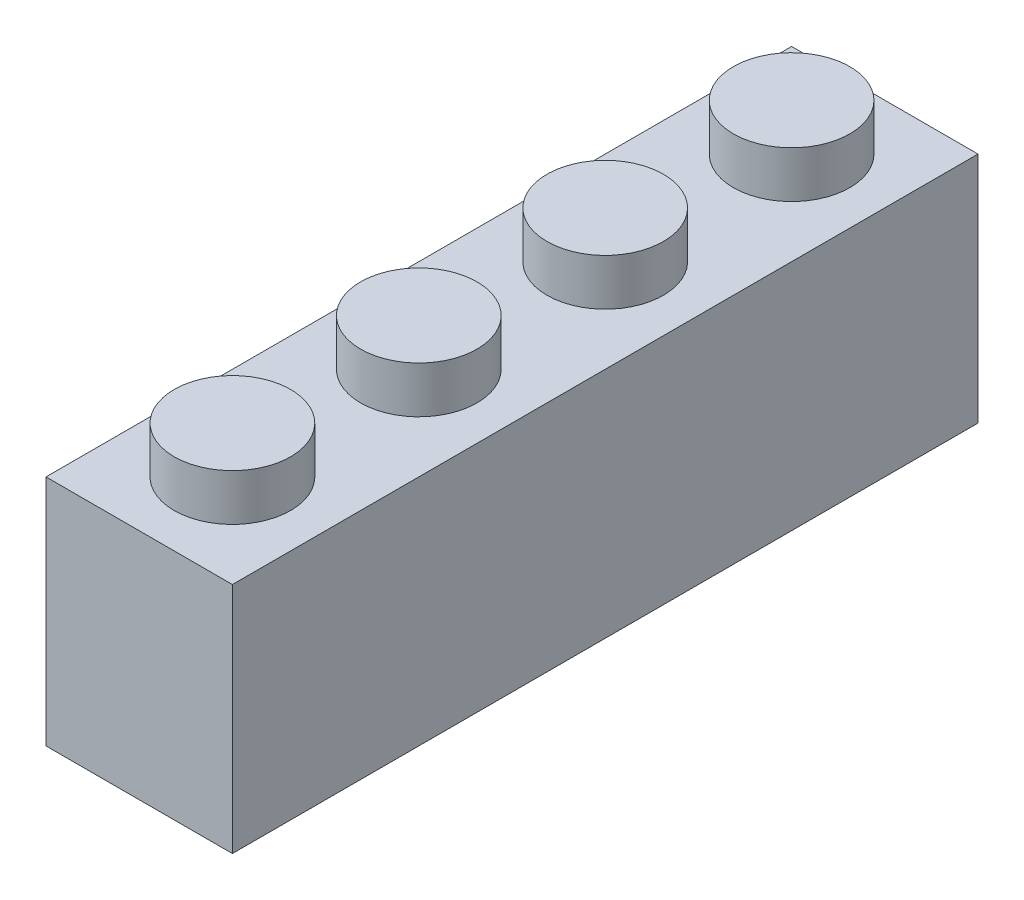
ISO-10303-21;
HEADER;
FILE_DESCRIPTION(('STEP AP214'),'2;1');
FILE_NAME('part.step','',(''),(''),'','','');
FILE_SCHEMA(('AUTOMOTIVE_DESIGN { 1 0 10303 214 1 1 1 1 }'));
ENDSEC;
DATA;
#1=APPLICATION_CONTEXT('core data for automotive mechanical design processes');
#2=APPLICATION_PROTOCOL_DEFINITION('international standard','automotive_design',2000,#1);
#3=PRODUCT_CONTEXT('',#1,'mechanical');
#4=PRODUCT('Part','Part','',(#3));
#5=PRODUCT_RELATED_PRODUCT_CATEGORY('part','',(#4));
#6=PRODUCT_DEFINITION_FORMATION('','',#4);
#7=PRODUCT_DEFINITION_CONTEXT('part definition',#1,'design');
#8=PRODUCT_DEFINITION('design','',#6,#7);
#9=PRODUCT_DEFINITION_SHAPE('','',#8);
#10=(LENGTH_UNIT() NAMED_UNIT(*) SI_UNIT(.MILLI.,.METRE.));
#11=(NAMED_UNIT(*) PLANE_ANGLE_UNIT() SI_UNIT($,.RADIAN.));
#12=(NAMED_UNIT(*) SI_UNIT($,.STERADIAN.) SOLID_ANGLE_UNIT());
#13=UNCERTAINTY_MEASURE_WITH_UNIT(LENGTH_MEASURE(1.E-05),#10,'distance_accuracy_value','');
#14=(GEOMETRIC_REPRESENTATION_CONTEXT(3) GLOBAL_UNCERTAINTY_ASSIGNED_CONTEXT((#13)) GLOBAL_UNIT_ASSIGNED_CONTEXT((#10,
#11,#12)) REPRESENTATION_CONTEXT('',''));
#15=CARTESIAN_POINT('',(0.,0.,0.));
#16=DIRECTION('',(0.,0.,1.));
#17=DIRECTION('',(1.,0.,0.));
#18=AXIS2_PLACEMENT_3D('',#15,#16,#17);
#19=CARTESIAN_POINT('',(-4.,4.,16.));
#20=DIRECTION('',(0.,1.,0.));
#21=DIRECTION('',(0.,0.,1.));
#22=AXIS2_PLACEMENT_3D('',#19,#20,#21);
#23=PLANE('',#22);
#24=CARTESIAN_POINT('',(0.,4.,12.));
#25=DIRECTION('',(0.,1.,0.));
#26=DIRECTION('',(0.,0.,1.));
#27=AXIS2_PLACEMENT_3D('',#24,#25,#26);
#28=CIRCLE('',#27,1.5);
#29=CARTESIAN_POINT('',(0.,4.,13.5));
#30=VERTEX_POINT('',#29);
#31=EDGE_CURVE('E179',#30,#30,#28,.T.);
#32=ORIENTED_EDGE('',*,*,#31,.T.);
#33=EDGE_LOOP('',(#32));
#34=FACE_BOUND('',#33,.T.);
#35=DIRECTION('',(0.,0.,1.));
#36=VECTOR('',#35,1.);
#37=CARTESIAN_POINT('',(-3.00000000000001,4.,-16.));
#38=LINE('',#37,#36);
#39=CARTESIAN_POINT('',(-3.00000000000001,4.,-15.));
#40=VERTEX_POINT('',#39);
#41=CARTESIAN_POINT('',(-3.,4.,15.));
#42=VERTEX_POINT('',#41);
#43=EDGE_CURVE('E135',#40,#42,#38,.T.);
#44=ORIENTED_EDGE('',*,*,#43,.F.);
#45=DIRECTION('',(-1.,0.,0.));
#46=VECTOR('',#45,1.);
#47=CARTESIAN_POINT('',(-4.00000000000001,4.,-15.));
#48=LINE('',#47,#46);
#49=CARTESIAN_POINT('',(2.99999999999999,4.,-15.));
#50=VERTEX_POINT('',#49);
#51=EDGE_CURVE('E144',#50,#40,#48,.T.);
#52=ORIENTED_EDGE('',*,*,#51,.F.);
#53=DIRECTION('',(0.,0.,-1.));
#54=VECTOR('',#53,1.);
#55=CARTESIAN_POINT('',(2.99999999999999,4.,-16.));
#56=LINE('',#55,#54);
#57=CARTESIAN_POINT('',(3.,4.,15.));
#58=VERTEX_POINT('',#57);
#59=EDGE_CURVE('E134',#58,#50,#56,.T.);
#60=ORIENTED_EDGE('',*,*,#59,.F.);
#61=DIRECTION('',(1.,0.,0.));
#62=VECTOR('',#61,1.);
#63=CARTESIAN_POINT('',(-4.,4.,15.));
#64=LINE('',#63,#62);
#65=EDGE_CURVE('E123',#42,#58,#64,.T.);
#66=ORIENTED_EDGE('',*,*,#65,.F.);
#67=EDGE_LOOP('',(#44,#52,#60,#66));
#68=FACE_BOUND('',#67,.T.);
#69=CARTESIAN_POINT('',(0.,4.,4.));
#70=DIRECTION('',(0.,1.,0.));
#71=DIRECTION('',(0.,0.,1.));
#72=AXIS2_PLACEMENT_3D('',#69,#70,#71);
#73=CIRCLE('',#72,1.5);
#74=CARTESIAN_POINT('',(0.,4.,5.5));
#75=VERTEX_POINT('',#74);
#76=EDGE_CURVE('E152',#75,#75,#73,.T.);
#77=ORIENTED_EDGE('',*,*,#76,.T.);
#78=EDGE_LOOP('',(#77));
#79=FACE_BOUND('',#78,.T.);
#80=CARTESIAN_POINT('',(0.,4.,-4.));
#81=DIRECTION('',(0.,1.,0.));
#82=DIRECTION('',(0.,0.,1.));
#83=AXIS2_PLACEMENT_3D('',#80,#81,#82);
#84=CIRCLE('',#83,1.5);
#85=CARTESIAN_POINT('',(0.,4.,-2.5));
#86=VERTEX_POINT('',#85);
#87=EDGE_CURVE('E158',#86,#86,#84,.T.);
#88=ORIENTED_EDGE('',*,*,#87,.T.);
#89=EDGE_LOOP('',(#88));
#90=FACE_BOUND('',#89,.T.);
#91=CARTESIAN_POINT('',(0.,4.,-12.));
#92=DIRECTION('',(0.,1.,0.));
#93=DIRECTION('',(0.,0.,1.));
#94=AXIS2_PLACEMENT_3D('',#91,#92,#93);
#95=CIRCLE('',#94,1.5);
#96=CARTESIAN_POINT('',(0.,4.,-10.5));
#97=VERTEX_POINT('',#96);
#98=EDGE_CURVE('E163',#97,#97,#95,.T.);
#99=ORIENTED_EDGE('',*,*,#98,.T.);
#100=EDGE_LOOP('',(#99));
#101=FACE_BOUND('',#100,.T.);
#102=CARTESIAN_POINT('',(0.,4.,8.));
#103=DIRECTION('',(0.,1.,0.));
#104=DIRECTION('',(0.,0.,1.));
#105=AXIS2_PLACEMENT_3D('',#102,#103,#104);
#106=CIRCLE('',#105,1.);
#107=CARTESIAN_POINT('',(0.,4.,9.));
#108=VERTEX_POINT('',#107);
#109=EDGE_CURVE('E268',#108,#108,#106,.F.);
#110=ORIENTED_EDGE('',*,*,#109,.F.);
#111=EDGE_LOOP('',(#110));
#112=FACE_BOUND('',#111,.T.);
#113=CARTESIAN_POINT('',(0.,4.,0.));
#114=DIRECTION('',(0.,1.,0.));
#115=DIRECTION('',(0.,0.,1.));
#116=AXIS2_PLACEMENT_3D('',#113,#114,#115);
#117=CIRCLE('',#116,1.);
#118=CARTESIAN_POINT('',(0.,4.,1.));
#119=VERTEX_POINT('',#118);
#120=EDGE_CURVE('E56',#119,#119,#117,.F.);
#121=ORIENTED_EDGE('',*,*,#120,.F.);
#122=EDGE_LOOP('',(#121));
#123=FACE_BOUND('',#122,.T.);
#124=CARTESIAN_POINT('',(0.,4.,-8.));
#125=DIRECTION('',(0.,1.,0.));
#126=DIRECTION('',(0.,0.,1.));
#127=AXIS2_PLACEMENT_3D('',#124,#125,#126);
#128=CIRCLE('',#127,1.);
#129=CARTESIAN_POINT('',(0.,4.,-7.));
#130=VERTEX_POINT('',#129);
#131=EDGE_CURVE('E12',#130,#130,#128,.F.);
#132=ORIENTED_EDGE('',*,*,#131,.F.);
#133=EDGE_LOOP('',(#132));
#134=FACE_BOUND('',#133,.T.);
#135=ADVANCED_FACE('F47',(#34,#68,#79,#90,#101,#112,#123,#134),#23,.F.);
#136=CARTESIAN_POINT('',(-4.,5.,16.));
#137=DIRECTION('',(0.,1.,0.));
#138=DIRECTION('',(0.,0.,1.));
#139=AXIS2_PLACEMENT_3D('',#136,#137,#138);
#140=PLANE('',#139);
#141=CARTESIAN_POINT('',(0.,5.,12.));
#142=DIRECTION('',(0.,1.,0.));
#143=DIRECTION('',(0.,0.,1.));
#144=AXIS2_PLACEMENT_3D('',#141,#142,#143);
#145=CIRCLE('',#144,2.5);
#146=CARTESIAN_POINT('',(0.,5.,14.5));
#147=VERTEX_POINT('',#146);
#148=EDGE_CURVE('E209',#147,#147,#145,.T.);
#149=ORIENTED_EDGE('',*,*,#148,.F.);
#150=EDGE_LOOP('',(#149));
#151=FACE_BOUND('',#150,.T.);
#152=DIRECTION('',(0.,0.,1.));
#153=VECTOR('',#152,1.);
#154=CARTESIAN_POINT('',(-4.00000000000001,5.,-16.));
#155=LINE('',#154,#153);
#156=CARTESIAN_POINT('',(-4.00000000000001,5.,-16.));
#157=VERTEX_POINT('',#156);
#158=CARTESIAN_POINT('',(-4.,5.,16.));
#159=VERTEX_POINT('',#158);
#160=EDGE_CURVE('E218',#157,#159,#155,.T.);
#161=ORIENTED_EDGE('',*,*,#160,.T.);
#162=DIRECTION('',(1.,0.,0.));
#163=VECTOR('',#162,1.);
#164=CARTESIAN_POINT('',(-4.,5.,16.));
#165=LINE('',#164,#163);
#166=CARTESIAN_POINT('',(4.,5.,16.));
#167=VERTEX_POINT('',#166);
#168=EDGE_CURVE('E101',#159,#167,#165,.T.);
#169=ORIENTED_EDGE('',*,*,#168,.T.);
#170=DIRECTION('',(0.,0.,-1.));
#171=VECTOR('',#170,1.);
#172=CARTESIAN_POINT('',(3.99999999999999,5.,-16.));
#173=LINE('',#172,#171);
#174=CARTESIAN_POINT('',(3.99999999999999,5.,-16.));
#175=VERTEX_POINT('',#174);
#176=EDGE_CURVE('E223',#167,#175,#173,.T.);
#177=ORIENTED_EDGE('',*,*,#176,.T.);
#178=DIRECTION('',(-1.,0.,0.));
#179=VECTOR('',#178,1.);
#180=CARTESIAN_POINT('',(-4.00000000000001,5.,-16.));
#181=LINE('',#180,#179);
#182=EDGE_CURVE('E72',#175,#157,#181,.T.);
#183=ORIENTED_EDGE('',*,*,#182,.T.);
#184=EDGE_LOOP('',(#161,#169,#177,#183));
#185=FACE_BOUND('',#184,.T.);
#186=CARTESIAN_POINT('',(0.,5.,4.));
#187=DIRECTION('',(0.,1.,0.));
#188=DIRECTION('',(0.,0.,1.));
#189=AXIS2_PLACEMENT_3D('',#186,#187,#188);
#190=CIRCLE('',#189,2.5);
#191=CARTESIAN_POINT('',(0.,5.,6.5));
#192=VERTEX_POINT('',#191);
#193=EDGE_CURVE('E189',#192,#192,#190,.T.);
#194=ORIENTED_EDGE('',*,*,#193,.F.);
#195=EDGE_LOOP('',(#194));
#196=FACE_BOUND('',#195,.T.);
#197=CARTESIAN_POINT('',(0.,5.,-4.));
#198=DIRECTION('',(0.,1.,0.));
#199=DIRECTION('',(0.,0.,1.));
#200=AXIS2_PLACEMENT_3D('',#197,#198,#199);
#201=CIRCLE('',#200,2.5);
#202=CARTESIAN_POINT('',(0.,5.,-1.5));
#203=VERTEX_POINT('',#202);
#204=EDGE_CURVE('E252',#203,#203,#201,.T.);
#205=ORIENTED_EDGE('',*,*,#204,.F.);
#206=EDGE_LOOP('',(#205));
#207=FACE_BOUND('',#206,.T.);
#208=CARTESIAN_POINT('',(0.,5.,-12.));
#209=DIRECTION('',(0.,1.,0.));
#210=DIRECTION('',(0.,0.,1.));
#211=AXIS2_PLACEMENT_3D('',#208,#209,#210);
#212=CIRCLE('',#211,2.5);
#213=CARTESIAN_POINT('',(0.,5.,-9.5));
#214=VERTEX_POINT('',#213);
#215=EDGE_CURVE('E260',#214,#214,#212,.T.);
#216=ORIENTED_EDGE('',*,*,#215,.F.);
#217=EDGE_LOOP('',(#216));
#218=FACE_BOUND('',#217,.T.);
#219=ADVANCED_FACE('F279',(#151,#185,#196,#207,#218),#140,.T.);
#220=CARTESIAN_POINT('',(-4.00000000000001,5.,-16.));
#221=DIRECTION('',(1.,0.,0.));
#222=DIRECTION('',(0.,0.,-1.));
#223=AXIS2_PLACEMENT_3D('',#220,#221,#222);
#224=PLANE('',#223);
#225=DIRECTION('',(0.,0.,1.));
#226=VECTOR('',#225,1.);
#227=CARTESIAN_POINT('',(-4.00000000000001,-5.,-16.));
#228=LINE('',#227,#226);
#229=CARTESIAN_POINT('',(-4.00000000000001,-5.,-16.));
#230=VERTEX_POINT('',#229);
#231=CARTESIAN_POINT('',(-4.,-5.,16.));
#232=VERTEX_POINT('',#231);
#233=EDGE_CURVE('E214',#230,#232,#228,.T.);
#234=ORIENTED_EDGE('',*,*,#233,.T.);
#235=DIRECTION('',(0.,-1.,0.));
#236=VECTOR('',#235,1.);
#237=CARTESIAN_POINT('',(-4.,5.,16.));
#238=LINE('',#237,#236);
#239=EDGE_CURVE('E249',#159,#232,#238,.T.);
#240=ORIENTED_EDGE('',*,*,#239,.F.);
#241=ORIENTED_EDGE('',*,*,#160,.F.);
#242=DIRECTION('',(0.,-1.,0.));
#243=VECTOR('',#242,1.);
#244=CARTESIAN_POINT('',(-4.00000000000001,5.,-16.));
#245=LINE('',#244,#243);
#246=EDGE_CURVE('E228',#157,#230,#245,.T.);
#247=ORIENTED_EDGE('',*,*,#246,.T.);
#248=EDGE_LOOP('',(#234,#240,#241,#247));
#249=FACE_BOUND('',#248,.T.);
#250=ADVANCED_FACE('F376',(#249),#224,.F.);
#251=CARTESIAN_POINT('',(-4.,5.,16.));
#252=DIRECTION('',(0.,0.,-1.));
#253=DIRECTION('',(-1.,0.,0.));
#254=AXIS2_PLACEMENT_3D('',#251,#252,#253);
#255=PLANE('',#254);
#256=DIRECTION('',(1.,0.,0.));
#257=VECTOR('',#256,1.);
#258=CARTESIAN_POINT('',(-4.,-5.,16.));
#259=LINE('',#258,#257);
#260=CARTESIAN_POINT('',(4.,-5.,16.));
#261=VERTEX_POINT('',#260);
#262=EDGE_CURVE('E232',#232,#261,#259,.T.);
#263=ORIENTED_EDGE('',*,*,#262,.T.);
#264=DIRECTION('',(0.,-1.,0.));
#265=VECTOR('',#264,1.);
#266=CARTESIAN_POINT('',(4.,5.,16.));
#267=LINE('',#266,#265);
#268=EDGE_CURVE('E245',#167,#261,#267,.T.);
#269=ORIENTED_EDGE('',*,*,#268,.F.);
#270=ORIENTED_EDGE('',*,*,#168,.F.);
#271=ORIENTED_EDGE('',*,*,#239,.T.);
#272=EDGE_LOOP('',(#263,#269,#270,#271));
#273=FACE_BOUND('',#272,.T.);
#274=ADVANCED_FACE('F387',(#273),#255,.F.);
#275=CARTESIAN_POINT('',(3.99999999999999,5.,-16.));
#276=DIRECTION('',(-1.,0.,0.));
#277=DIRECTION('',(0.,0.,1.));
#278=AXIS2_PLACEMENT_3D('',#275,#276,#277);
#279=PLANE('',#278);
#280=DIRECTION('',(0.,0.,-1.));
#281=VECTOR('',#280,1.);
#282=CARTESIAN_POINT('',(3.99999999999999,-5.,-16.));
#283=LINE('',#282,#281);
#284=CARTESIAN_POINT('',(3.99999999999999,-5.,-16.));
#285=VERTEX_POINT('',#284);
#286=EDGE_CURVE('E235',#261,#285,#283,.T.);
#287=ORIENTED_EDGE('',*,*,#286,.T.);
#288=DIRECTION('',(0.,-1.,0.));
#289=VECTOR('',#288,1.);
#290=CARTESIAN_POINT('',(3.99999999999999,5.,-16.));
#291=LINE('',#290,#289);
#292=EDGE_CURVE('E242',#175,#285,#291,.T.);
#293=ORIENTED_EDGE('',*,*,#292,.F.);
#294=ORIENTED_EDGE('',*,*,#176,.F.);
#295=ORIENTED_EDGE('',*,*,#268,.T.);
#296=EDGE_LOOP('',(#287,#293,#294,#295));
#297=FACE_BOUND('',#296,.T.);
#298=ADVANCED_FACE('F384',(#297),#279,.F.);
#299=CARTESIAN_POINT('',(-4.00000000000001,5.,-16.));
#300=DIRECTION('',(0.,0.,1.));
#301=DIRECTION('',(1.,0.,0.));
#302=AXIS2_PLACEMENT_3D('',#299,#300,#301);
#303=PLANE('',#302);
#304=DIRECTION('',(-1.,0.,0.));
#305=VECTOR('',#304,1.);
#306=CARTESIAN_POINT('',(-4.00000000000001,-5.,-16.));
#307=LINE('',#306,#305);
#308=EDGE_CURVE('E93',#285,#230,#307,.T.);
#309=ORIENTED_EDGE('',*,*,#308,.T.);
#310=ORIENTED_EDGE('',*,*,#246,.F.);
#311=ORIENTED_EDGE('',*,*,#182,.F.);
#312=ORIENTED_EDGE('',*,*,#292,.T.);
#313=EDGE_LOOP('',(#309,#310,#311,#312));
#314=FACE_BOUND('',#313,.T.);
#315=ADVANCED_FACE('F380',(#314),#303,.F.);
#316=CARTESIAN_POINT('',(-4.,-5.,16.));
#317=DIRECTION('',(0.,1.,0.));
#318=DIRECTION('',(0.,0.,1.));
#319=AXIS2_PLACEMENT_3D('',#316,#317,#318);
#320=PLANE('',#319);
#321=DIRECTION('',(-1.,0.,0.));
#322=VECTOR('',#321,1.);
#323=CARTESIAN_POINT('',(-4.00000000000001,-5.,-15.));
#324=LINE('',#323,#322);
#325=CARTESIAN_POINT('',(2.99999999999999,-5.,-15.));
#326=VERTEX_POINT('',#325);
#327=CARTESIAN_POINT('',(-3.00000000000001,-5.,-15.));
#328=VERTEX_POINT('',#327);
#329=EDGE_CURVE('E194',#326,#328,#324,.T.);
#330=ORIENTED_EDGE('',*,*,#329,.T.);
#331=DIRECTION('',(0.,0.,1.));
#332=VECTOR('',#331,1.);
#333=CARTESIAN_POINT('',(-3.00000000000001,-5.,-16.));
#334=LINE('',#333,#332);
#335=CARTESIAN_POINT('',(-3.,-5.,15.));
#336=VERTEX_POINT('',#335);
#337=EDGE_CURVE('E178',#328,#336,#334,.T.);
#338=ORIENTED_EDGE('',*,*,#337,.T.);
#339=DIRECTION('',(1.,0.,0.));
#340=VECTOR('',#339,1.);
#341=CARTESIAN_POINT('',(-4.,-5.,15.));
#342=LINE('',#341,#340);
#343=CARTESIAN_POINT('',(3.,-5.,15.));
#344=VERTEX_POINT('',#343);
#345=EDGE_CURVE('E193',#336,#344,#342,.T.);
#346=ORIENTED_EDGE('',*,*,#345,.T.);
#347=DIRECTION('',(0.,0.,-1.));
#348=VECTOR('',#347,1.);
#349=CARTESIAN_POINT('',(2.99999999999999,-5.,-16.));
#350=LINE('',#349,#348);
#351=EDGE_CURVE('E63',#344,#326,#350,.T.);
#352=ORIENTED_EDGE('',*,*,#351,.T.);
#353=EDGE_LOOP('',(#330,#338,#346,#352));
#354=FACE_BOUND('',#353,.T.);
#355=ORIENTED_EDGE('',*,*,#233,.F.);
#356=ORIENTED_EDGE('',*,*,#308,.F.);
#357=ORIENTED_EDGE('',*,*,#286,.F.);
#358=ORIENTED_EDGE('',*,*,#262,.F.);
#359=EDGE_LOOP('',(#355,#356,#357,#358));
#360=FACE_BOUND('',#359,.T.);
#361=ADVANCED_FACE('F372',(#354,#360),#320,.F.);
#362=CARTESIAN_POINT('',(0.,7.,12.));
#363=DIRECTION('',(0.,-1.,0.));
#364=DIRECTION('',(0.,0.,-1.));
#365=AXIS2_PLACEMENT_3D('',#362,#363,#364);
#366=CYLINDRICAL_SURFACE('',#365,2.5);
#367=CARTESIAN_POINT('',(0.,7.,12.));
#368=DIRECTION('',(0.,1.,0.));
#369=DIRECTION('',(0.,0.,1.));
#370=AXIS2_PLACEMENT_3D('',#367,#368,#369);
#371=CIRCLE('',#370,2.5);
#372=CARTESIAN_POINT('',(0.,7.,14.5));
#373=VERTEX_POINT('',#372);
#374=EDGE_CURVE('E210',#373,#373,#371,.T.);
#375=ORIENTED_EDGE('',*,*,#374,.F.);
#376=EDGE_LOOP('',(#375));
#377=FACE_BOUND('',#376,.T.);
#378=ORIENTED_EDGE('',*,*,#148,.T.);
#379=EDGE_LOOP('',(#378));
#380=FACE_BOUND('',#379,.T.);
#381=ADVANCED_FACE('F368',(#377,#380),#366,.T.);
#382=CARTESIAN_POINT('',(0.,7.,12.));
#383=DIRECTION('',(0.,1.,0.));
#384=DIRECTION('',(0.,0.,1.));
#385=AXIS2_PLACEMENT_3D('',#382,#383,#384);
#386=PLANE('',#385);
#387=ORIENTED_EDGE('',*,*,#374,.T.);
#388=EDGE_LOOP('',(#387));
#389=FACE_BOUND('',#388,.T.);
#390=ADVANCED_FACE('F364',(#389),#386,.T.);
#391=CARTESIAN_POINT('',(0.,7.,4.));
#392=DIRECTION('',(0.,-1.,0.));
#393=DIRECTION('',(0.,0.,-1.));
#394=AXIS2_PLACEMENT_3D('',#391,#392,#393);
#395=CYLINDRICAL_SURFACE('',#394,2.5);
#396=CARTESIAN_POINT('',(0.,7.,4.));
#397=DIRECTION('',(0.,1.,0.));
#398=DIRECTION('',(0.,0.,1.));
#399=AXIS2_PLACEMENT_3D('',#396,#397,#398);
#400=CIRCLE('',#399,2.5);
#401=CARTESIAN_POINT('',(0.,7.,6.5));
#402=VERTEX_POINT('',#401);
#403=EDGE_CURVE('E205',#402,#402,#400,.T.);
#404=ORIENTED_EDGE('',*,*,#403,.F.);
#405=EDGE_LOOP('',(#404));
#406=FACE_BOUND('',#405,.T.);
#407=ORIENTED_EDGE('',*,*,#193,.T.);
#408=EDGE_LOOP('',(#407));
#409=FACE_BOUND('',#408,.T.);
#410=ADVANCED_FACE('F360',(#406,#409),#395,.T.);
#411=CARTESIAN_POINT('',(0.,7.,4.));
#412=DIRECTION('',(0.,1.,0.));
#413=DIRECTION('',(0.,0.,1.));
#414=AXIS2_PLACEMENT_3D('',#411,#412,#413);
#415=PLANE('',#414);
#416=ORIENTED_EDGE('',*,*,#403,.T.);
#417=EDGE_LOOP('',(#416));
#418=FACE_BOUND('',#417,.T.);
#419=ADVANCED_FACE('F356',(#418),#415,.T.);
#420=CARTESIAN_POINT('',(0.,7.,-4.));
#421=DIRECTION('',(0.,1.,0.));
#422=DIRECTION('',(0.,0.,1.));
#423=AXIS2_PLACEMENT_3D('',#420,#421,#422);
#424=PLANE('',#423);
#425=CARTESIAN_POINT('',(0.,7.,-4.));
#426=DIRECTION('',(0.,1.,0.));
#427=DIRECTION('',(0.,0.,1.));
#428=AXIS2_PLACEMENT_3D('',#425,#426,#427);
#429=CIRCLE('',#428,2.5);
#430=CARTESIAN_POINT('',(0.,7.,-1.5));
#431=VERTEX_POINT('',#430);
#432=EDGE_CURVE('E256',#431,#431,#429,.T.);
#433=ORIENTED_EDGE('',*,*,#432,.T.);
#434=EDGE_LOOP('',(#433));
#435=FACE_BOUND('',#434,.T.);
#436=ADVANCED_FACE('F359',(#435),#424,.T.);
#437=CARTESIAN_POINT('',(0.,7.,-4.));
#438=DIRECTION('',(0.,-1.,0.));
#439=DIRECTION('',(0.,0.,-1.));
#440=AXIS2_PLACEMENT_3D('',#437,#438,#439);
#441=CYLINDRICAL_SURFACE('',#440,2.5);
#442=ORIENTED_EDGE('',*,*,#432,.F.);
#443=EDGE_LOOP('',(#442));
#444=FACE_BOUND('',#443,.T.);
#445=ORIENTED_EDGE('',*,*,#204,.T.);
#446=EDGE_LOOP('',(#445));
#447=FACE_BOUND('',#446,.T.);
#448=ADVANCED_FACE('F394',(#444,#447),#441,.T.);
#449=CARTESIAN_POINT('',(0.,7.,-12.));
#450=DIRECTION('',(0.,1.,0.));
#451=DIRECTION('',(0.,0.,1.));
#452=AXIS2_PLACEMENT_3D('',#449,#450,#451);
#453=PLANE('',#452);
#454=CARTESIAN_POINT('',(0.,7.,-12.));
#455=DIRECTION('',(0.,1.,0.));
#456=DIRECTION('',(0.,0.,1.));
#457=AXIS2_PLACEMENT_3D('',#454,#455,#456);
#458=CIRCLE('',#457,2.5);
#459=CARTESIAN_POINT('',(0.,7.,-9.5));
#460=VERTEX_POINT('',#459);
#461=EDGE_CURVE('E264',#460,#460,#458,.T.);
#462=ORIENTED_EDGE('',*,*,#461,.T.);
#463=EDGE_LOOP('',(#462));
#464=FACE_BOUND('',#463,.T.);
#465=ADVANCED_FACE('F49',(#464),#453,.T.);
#466=CARTESIAN_POINT('',(0.,7.,-12.));
#467=DIRECTION('',(0.,-1.,0.));
#468=DIRECTION('',(0.,0.,-1.));
#469=AXIS2_PLACEMENT_3D('',#466,#467,#468);
#470=CYLINDRICAL_SURFACE('',#469,2.5);
#471=ORIENTED_EDGE('',*,*,#461,.F.);
#472=EDGE_LOOP('',(#471));
#473=FACE_BOUND('',#472,.T.);
#474=ORIENTED_EDGE('',*,*,#215,.T.);
#475=EDGE_LOOP('',(#474));
#476=FACE_BOUND('',#475,.T.);
#477=ADVANCED_FACE('F315',(#473,#476),#470,.T.);
#478=CARTESIAN_POINT('',(-3.00000000000001,5.,-16.));
#479=DIRECTION('',(1.,0.,0.));
#480=DIRECTION('',(0.,0.,-1.));
#481=AXIS2_PLACEMENT_3D('',#478,#479,#480);
#482=PLANE('',#481);
#483=ORIENTED_EDGE('',*,*,#337,.F.);
#484=DIRECTION('',(0.,-1.,0.));
#485=VECTOR('',#484,1.);
#486=CARTESIAN_POINT('',(-3.00000000000001,5.,-15.));
#487=LINE('',#486,#485);
#488=EDGE_CURVE('E148',#40,#328,#487,.T.);
#489=ORIENTED_EDGE('',*,*,#488,.F.);
#490=ORIENTED_EDGE('',*,*,#43,.T.);
#491=DIRECTION('',(0.,-1.,0.));
#492=VECTOR('',#491,1.);
#493=CARTESIAN_POINT('',(-3.,5.,15.));
#494=LINE('',#493,#492);
#495=EDGE_CURVE('E128',#42,#336,#494,.T.);
#496=ORIENTED_EDGE('',*,*,#495,.T.);
#497=EDGE_LOOP('',(#483,#489,#490,#496));
#498=FACE_BOUND('',#497,.T.);
#499=ADVANCED_FACE('F312',(#498),#482,.T.);
#500=CARTESIAN_POINT('',(-4.,5.,15.));
#501=DIRECTION('',(0.,0.,-1.));
#502=DIRECTION('',(-1.,0.,0.));
#503=AXIS2_PLACEMENT_3D('',#500,#501,#502);
#504=PLANE('',#503);
#505=ORIENTED_EDGE('',*,*,#345,.F.);
#506=ORIENTED_EDGE('',*,*,#495,.F.);
#507=ORIENTED_EDGE('',*,*,#65,.T.);
#508=DIRECTION('',(0.,-1.,0.));
#509=VECTOR('',#508,1.);
#510=CARTESIAN_POINT('',(3.,5.,15.));
#511=LINE('',#510,#509);
#512=EDGE_CURVE('E125',#58,#344,#511,.T.);
#513=ORIENTED_EDGE('',*,*,#512,.T.);
#514=EDGE_LOOP('',(#505,#506,#507,#513));
#515=FACE_BOUND('',#514,.T.);
#516=ADVANCED_FACE('F124',(#515),#504,.T.);
#517=CARTESIAN_POINT('',(2.99999999999999,5.,-16.));
#518=DIRECTION('',(-1.,0.,0.));
#519=DIRECTION('',(0.,0.,1.));
#520=AXIS2_PLACEMENT_3D('',#517,#518,#519);
#521=PLANE('',#520);
#522=ORIENTED_EDGE('',*,*,#351,.F.);
#523=ORIENTED_EDGE('',*,*,#512,.F.);
#524=ORIENTED_EDGE('',*,*,#59,.T.);
#525=DIRECTION('',(0.,-1.,0.));
#526=VECTOR('',#525,1.);
#527=CARTESIAN_POINT('',(2.99999999999999,5.,-15.));
#528=LINE('',#527,#526);
#529=EDGE_CURVE('E140',#50,#326,#528,.T.);
#530=ORIENTED_EDGE('',*,*,#529,.T.);
#531=EDGE_LOOP('',(#522,#523,#524,#530));
#532=FACE_BOUND('',#531,.T.);
#533=ADVANCED_FACE('F137',(#532),#521,.T.);
#534=CARTESIAN_POINT('',(-4.00000000000001,5.,-15.));
#535=DIRECTION('',(0.,0.,1.));
#536=DIRECTION('',(1.,0.,0.));
#537=AXIS2_PLACEMENT_3D('',#534,#535,#536);
#538=PLANE('',#537);
#539=ORIENTED_EDGE('',*,*,#329,.F.);
#540=ORIENTED_EDGE('',*,*,#529,.F.);
#541=ORIENTED_EDGE('',*,*,#51,.T.);
#542=ORIENTED_EDGE('',*,*,#488,.T.);
#543=EDGE_LOOP('',(#539,#540,#541,#542));
#544=FACE_BOUND('',#543,.T.);
#545=ADVANCED_FACE('F321',(#544),#538,.T.);
#546=CARTESIAN_POINT('',(0.,7.,12.));
#547=DIRECTION('',(0.,-1.,0.));
#548=DIRECTION('',(0.,0.,-1.));
#549=AXIS2_PLACEMENT_3D('',#546,#547,#548);
#550=CYLINDRICAL_SURFACE('',#549,1.5);
#551=CARTESIAN_POINT('',(0.,6.,12.));
#552=DIRECTION('',(0.,1.,0.));
#553=DIRECTION('',(0.,0.,1.));
#554=AXIS2_PLACEMENT_3D('',#551,#552,#553);
#555=CIRCLE('',#554,1.5);
#556=CARTESIAN_POINT('',(0.,6.,13.5));
#557=VERTEX_POINT('',#556);
#558=EDGE_CURVE('E174',#557,#557,#555,.T.);
#559=ORIENTED_EDGE('',*,*,#558,.T.);
#560=EDGE_LOOP('',(#559));
#561=FACE_BOUND('',#560,.T.);
#562=ORIENTED_EDGE('',*,*,#31,.F.);
#563=EDGE_LOOP('',(#562));
#564=FACE_BOUND('',#563,.T.);
#565=ADVANCED_FACE('F324',(#561,#564),#550,.F.);
#566=CARTESIAN_POINT('',(0.,6.,12.));
#567=DIRECTION('',(0.,1.,0.));
#568=DIRECTION('',(0.,0.,1.));
#569=AXIS2_PLACEMENT_3D('',#566,#567,#568);
#570=PLANE('',#569);
#571=ORIENTED_EDGE('',*,*,#558,.F.);
#572=EDGE_LOOP('',(#571));
#573=FACE_BOUND('',#572,.T.);
#574=ADVANCED_FACE('F328',(#573),#570,.F.);
#575=CARTESIAN_POINT('',(0.,7.,4.));
#576=DIRECTION('',(0.,-1.,0.));
#577=DIRECTION('',(0.,0.,-1.));
#578=AXIS2_PLACEMENT_3D('',#575,#576,#577);
#579=CYLINDRICAL_SURFACE('',#578,1.5);
#580=CARTESIAN_POINT('',(0.,6.,4.));
#581=DIRECTION('',(0.,1.,0.));
#582=DIRECTION('',(0.,0.,1.));
#583=AXIS2_PLACEMENT_3D('',#580,#581,#582);
#584=CIRCLE('',#583,1.5);
#585=CARTESIAN_POINT('',(0.,6.,5.5));
#586=VERTEX_POINT('',#585);
#587=EDGE_CURVE('E156',#586,#586,#584,.T.);
#588=ORIENTED_EDGE('',*,*,#587,.T.);
#589=EDGE_LOOP('',(#588));
#590=FACE_BOUND('',#589,.T.);
#591=ORIENTED_EDGE('',*,*,#76,.F.);
#592=EDGE_LOOP('',(#591));
#593=FACE_BOUND('',#592,.T.);
#594=ADVANCED_FACE('F332',(#590,#593),#579,.F.);
#595=CARTESIAN_POINT('',(0.,6.,4.));
#596=DIRECTION('',(0.,1.,0.));
#597=DIRECTION('',(0.,0.,1.));
#598=AXIS2_PLACEMENT_3D('',#595,#596,#597);
#599=PLANE('',#598);
#600=ORIENTED_EDGE('',*,*,#587,.F.);
#601=EDGE_LOOP('',(#600));
#602=FACE_BOUND('',#601,.T.);
#603=ADVANCED_FACE('F336',(#602),#599,.F.);
#604=CARTESIAN_POINT('',(0.,6.,-4.));
#605=DIRECTION('',(0.,1.,0.));
#606=DIRECTION('',(0.,0.,1.));
#607=AXIS2_PLACEMENT_3D('',#604,#605,#606);
#608=PLANE('',#607);
#609=CARTESIAN_POINT('',(0.,6.,-4.));
#610=DIRECTION('',(0.,1.,0.));
#611=DIRECTION('',(0.,0.,1.));
#612=AXIS2_PLACEMENT_3D('',#609,#610,#611);
#613=CIRCLE('',#612,1.5);
#614=CARTESIAN_POINT('',(0.,6.,-2.5));
#615=VERTEX_POINT('',#614);
#616=EDGE_CURVE('E162',#615,#615,#613,.T.);
#617=ORIENTED_EDGE('',*,*,#616,.F.);
#618=EDGE_LOOP('',(#617));
#619=FACE_BOUND('',#618,.T.);
#620=ADVANCED_FACE('F340',(#619),#608,.F.);
#621=CARTESIAN_POINT('',(0.,7.,-4.));
#622=DIRECTION('',(0.,-1.,0.));
#623=DIRECTION('',(0.,0.,-1.));
#624=AXIS2_PLACEMENT_3D('',#621,#622,#623);
#625=CYLINDRICAL_SURFACE('',#624,1.5);
#626=ORIENTED_EDGE('',*,*,#616,.T.);
#627=EDGE_LOOP('',(#626));
#628=FACE_BOUND('',#627,.T.);
#629=ORIENTED_EDGE('',*,*,#87,.F.);
#630=EDGE_LOOP('',(#629));
#631=FACE_BOUND('',#630,.T.);
#632=ADVANCED_FACE('F344',(#628,#631),#625,.F.);
#633=CARTESIAN_POINT('',(0.,6.,-12.));
#634=DIRECTION('',(0.,1.,0.));
#635=DIRECTION('',(0.,0.,1.));
#636=AXIS2_PLACEMENT_3D('',#633,#634,#635);
#637=PLANE('',#636);
#638=CARTESIAN_POINT('',(0.,6.,-12.));
#639=DIRECTION('',(0.,1.,0.));
#640=DIRECTION('',(0.,0.,1.));
#641=AXIS2_PLACEMENT_3D('',#638,#639,#640);
#642=CIRCLE('',#641,1.5);
#643=CARTESIAN_POINT('',(0.,6.,-10.5));
#644=VERTEX_POINT('',#643);
#645=EDGE_CURVE('E167',#644,#644,#642,.T.);
#646=ORIENTED_EDGE('',*,*,#645,.F.);
#647=EDGE_LOOP('',(#646));
#648=FACE_BOUND('',#647,.T.);
#649=ADVANCED_FACE('F348',(#648),#637,.F.);
#650=CARTESIAN_POINT('',(0.,7.,-12.));
#651=DIRECTION('',(0.,-1.,0.));
#652=DIRECTION('',(0.,0.,-1.));
#653=AXIS2_PLACEMENT_3D('',#650,#651,#652);
#654=CYLINDRICAL_SURFACE('',#653,1.5);
#655=ORIENTED_EDGE('',*,*,#645,.T.);
#656=EDGE_LOOP('',(#655));
#657=FACE_BOUND('',#656,.T.);
#658=ORIENTED_EDGE('',*,*,#98,.F.);
#659=EDGE_LOOP('',(#658));
#660=FACE_BOUND('',#659,.T.);
#661=ADVANCED_FACE('F309',(#657,#660),#654,.F.);
#662=CARTESIAN_POINT('',(0.,-7.8284271247462,8.));
#663=DIRECTION('',(0.,1.,0.));
#664=DIRECTION('',(0.,0.,1.));
#665=AXIS2_PLACEMENT_3D('',#662,#663,#664);
#666=CYLINDRICAL_SURFACE('',#665,1.);
#667=CARTESIAN_POINT('',(0.,-4.,8.));
#668=DIRECTION('',(0.,1.,0.));
#669=DIRECTION('',(0.,0.,1.));
#670=AXIS2_PLACEMENT_3D('',#667,#668,#669);
#671=CIRCLE('',#670,1.);
#672=CARTESIAN_POINT('',(0.,-4.,9.));
#673=VERTEX_POINT('',#672);
#674=EDGE_CURVE('E157',#673,#673,#671,.T.);
#675=ORIENTED_EDGE('',*,*,#674,.T.);
#676=EDGE_LOOP('',(#675));
#677=FACE_BOUND('',#676,.T.);
#678=ORIENTED_EDGE('',*,*,#109,.T.);
#679=EDGE_LOOP('',(#678));
#680=FACE_BOUND('',#679,.T.);
#681=ADVANCED_FACE('F306',(#677,#680),#666,.T.);
#682=CARTESIAN_POINT('',(-4.,-4.,16.));
#683=DIRECTION('',(0.,1.,0.));
#684=DIRECTION('',(0.,0.,1.));
#685=AXIS2_PLACEMENT_3D('',#682,#683,#684);
#686=PLANE('',#685);
#687=ORIENTED_EDGE('',*,*,#674,.F.);
#688=EDGE_LOOP('',(#687));
#689=FACE_BOUND('',#688,.T.);
#690=ADVANCED_FACE('F302',(#689),#686,.F.);
#691=CARTESIAN_POINT('',(0.,-7.8284271247462,0.));
#692=DIRECTION('',(0.,1.,0.));
#693=DIRECTION('',(0.,0.,1.));
#694=AXIS2_PLACEMENT_3D('',#691,#692,#693);
#695=CYLINDRICAL_SURFACE('',#694,1.);
#696=CARTESIAN_POINT('',(0.,-4.,0.));
#697=DIRECTION('',(0.,1.,0.));
#698=DIRECTION('',(0.,0.,1.));
#699=AXIS2_PLACEMENT_3D('',#696,#697,#698);
#700=CIRCLE('',#699,1.);
#701=CARTESIAN_POINT('',(0.,-4.,1.));
#702=VERTEX_POINT('',#701);
#703=EDGE_CURVE('E629',#702,#702,#700,.T.);
#704=ORIENTED_EDGE('',*,*,#703,.T.);
#705=EDGE_LOOP('',(#704));
#706=FACE_BOUND('',#705,.T.);
#707=ORIENTED_EDGE('',*,*,#120,.T.);
#708=EDGE_LOOP('',(#707));
#709=FACE_BOUND('',#708,.T.);
#710=ADVANCED_FACE('F275',(#706,#709),#695,.T.);
#711=CARTESIAN_POINT('',(-4.,-4.,16.));
#712=DIRECTION('',(0.,1.,0.));
#713=DIRECTION('',(0.,0.,1.));
#714=AXIS2_PLACEMENT_3D('',#711,#712,#713);
#715=PLANE('',#714);
#716=ORIENTED_EDGE('',*,*,#703,.F.);
#717=EDGE_LOOP('',(#716));
#718=FACE_BOUND('',#717,.T.);
#719=ADVANCED_FACE('F287',(#718),#715,.F.);
#720=CARTESIAN_POINT('',(0.,-7.8284271247462,-8.));
#721=DIRECTION('',(0.,1.,0.));
#722=DIRECTION('',(0.,0.,1.));
#723=AXIS2_PLACEMENT_3D('',#720,#721,#722);
#724=CYLINDRICAL_SURFACE('',#723,1.);
#725=CARTESIAN_POINT('',(0.,-4.,-8.));
#726=DIRECTION('',(0.,1.,0.));
#727=DIRECTION('',(0.,0.,1.));
#728=AXIS2_PLACEMENT_3D('',#725,#726,#727);
#729=CIRCLE('',#728,1.);
#730=CARTESIAN_POINT('',(0.,-4.,-7.));
#731=VERTEX_POINT('',#730);
#732=EDGE_CURVE('E633',#731,#731,#729,.T.);
#733=ORIENTED_EDGE('',*,*,#732,.T.);
#734=EDGE_LOOP('',(#733));
#735=FACE_BOUND('',#734,.T.);
#736=ORIENTED_EDGE('',*,*,#131,.T.);
#737=EDGE_LOOP('',(#736));
#738=FACE_BOUND('',#737,.T.);
#739=ADVANCED_FACE('F284',(#735,#738),#724,.T.);
#740=CARTESIAN_POINT('',(-4.,-4.,16.));
#741=DIRECTION('',(0.,1.,0.));
#742=DIRECTION('',(0.,0.,1.));
#743=AXIS2_PLACEMENT_3D('',#740,#741,#742);
#744=PLANE('',#743);
#745=ORIENTED_EDGE('',*,*,#732,.F.);
#746=EDGE_LOOP('',(#745));
#747=FACE_BOUND('',#746,.T.);
#748=ADVANCED_FACE('F286',(#747),#744,.F.);
#749=CLOSED_SHELL('',(#135,#219,#250,#274,#298,#315,#361,#381,#390,#410,#419,#436,#448,#465,
#477,#499,#516,#533,#545,#565,#574,#594,#603,#620,#632,#649,#661,#681,#690,#710,#719,#739,#748));
#750=MANIFOLD_SOLID_BREP('B2',#749);
#751=ADVANCED_BREP_SHAPE_REPRESENTATION('',(#18,#750),#14);
#752=SHAPE_DEFINITION_REPRESENTATION(#9,#751);
ENDSEC;
END-ISO-10303-21;
